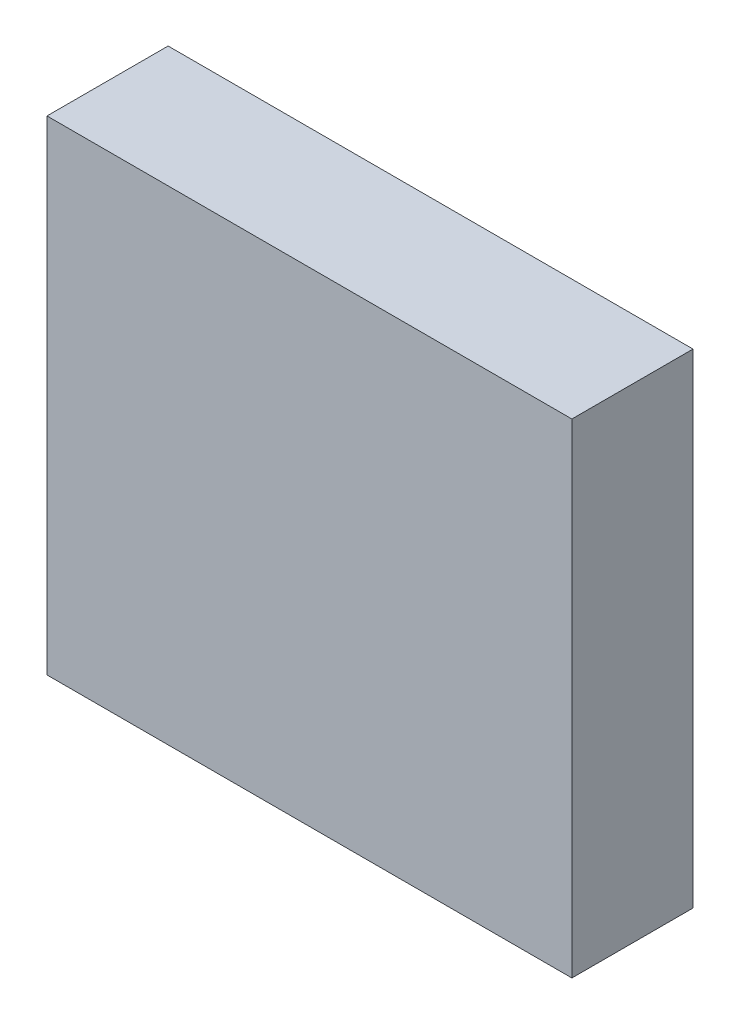
ISO-10303-21;
HEADER;
FILE_DESCRIPTION(('STEP AP214'),'2;1');
FILE_NAME('part.step','',(''),(''),'','','');
FILE_SCHEMA(('AUTOMOTIVE_DESIGN { 1 0 10303 214 1 1 1 1 }'));
ENDSEC;
DATA;
#1=APPLICATION_CONTEXT('core data for automotive mechanical design processes');
#2=APPLICATION_PROTOCOL_DEFINITION('international standard','automotive_design',2000,#1);
#3=PRODUCT_CONTEXT('',#1,'mechanical');
#4=PRODUCT('Part','Part','',(#3));
#5=PRODUCT_RELATED_PRODUCT_CATEGORY('part','',(#4));
#6=PRODUCT_DEFINITION_FORMATION('','',#4);
#7=PRODUCT_DEFINITION_CONTEXT('part definition',#1,'design');
#8=PRODUCT_DEFINITION('design','',#6,#7);
#9=PRODUCT_DEFINITION_SHAPE('','',#8);
#10=(LENGTH_UNIT() NAMED_UNIT(*) SI_UNIT(.MILLI.,.METRE.));
#11=(NAMED_UNIT(*) PLANE_ANGLE_UNIT() SI_UNIT($,.RADIAN.));
#12=(NAMED_UNIT(*) SI_UNIT($,.STERADIAN.) SOLID_ANGLE_UNIT());
#13=UNCERTAINTY_MEASURE_WITH_UNIT(LENGTH_MEASURE(1.E-05),#10,'distance_accuracy_value','');
#14=(GEOMETRIC_REPRESENTATION_CONTEXT(3) GLOBAL_UNCERTAINTY_ASSIGNED_CONTEXT((#13)) GLOBAL_UNIT_ASSIGNED_CONTEXT((#10,
#11,#12)) REPRESENTATION_CONTEXT('',''));
#15=CARTESIAN_POINT('',(0.,0.,0.));
#16=DIRECTION('',(0.,0.,1.));
#17=DIRECTION('',(1.,0.,0.));
#18=AXIS2_PLACEMENT_3D('',#15,#16,#17);
#19=CARTESIAN_POINT('',(82.55,-76.13777,38.1));
#20=DIRECTION('',(-1.,0.,0.));
#21=DIRECTION('',(0.,0.,1.));
#22=AXIS2_PLACEMENT_3D('',#19,#20,#21);
#23=PLANE('',#22);
#24=DIRECTION('',(0.,1.,0.));
#25=VECTOR('',#24,1.);
#26=CARTESIAN_POINT('',(82.55,-76.13777,0.));
#27=LINE('',#26,#25);
#28=CARTESIAN_POINT('',(82.55,-76.13777,0.));
#29=VERTEX_POINT('',#28);
#30=CARTESIAN_POINT('',(82.55,76.13777,0.));
#31=VERTEX_POINT('',#30);
#32=EDGE_CURVE('E104',#29,#31,#27,.T.);
#33=ORIENTED_EDGE('',*,*,#32,.T.);
#34=DIRECTION('',(0.,0.,-1.));
#35=VECTOR('',#34,1.);
#36=CARTESIAN_POINT('',(82.55,76.13777,38.1));
#37=LINE('',#36,#35);
#38=CARTESIAN_POINT('',(82.55,76.13777,38.1));
#39=VERTEX_POINT('',#38);
#40=EDGE_CURVE('E11',#39,#31,#37,.T.);
#41=ORIENTED_EDGE('',*,*,#40,.F.);
#42=DIRECTION('',(0.,1.,0.));
#43=VECTOR('',#42,1.);
#44=CARTESIAN_POINT('',(82.55,-76.13777,38.1));
#45=LINE('',#44,#43);
#46=CARTESIAN_POINT('',(82.55,-76.13777,38.1));
#47=VERTEX_POINT('',#46);
#48=EDGE_CURVE('E92',#47,#39,#45,.T.);
#49=ORIENTED_EDGE('',*,*,#48,.F.);
#50=DIRECTION('',(0.,0.,-1.));
#51=VECTOR('',#50,1.);
#52=CARTESIAN_POINT('',(82.55,-76.13777,38.1));
#53=LINE('',#52,#51);
#54=EDGE_CURVE('E100',#47,#29,#53,.T.);
#55=ORIENTED_EDGE('',*,*,#54,.T.);
#56=EDGE_LOOP('',(#33,#41,#49,#55));
#57=FACE_BOUND('',#56,.T.);
#58=ADVANCED_FACE('F41',(#57),#23,.F.);
#59=CARTESIAN_POINT('',(-82.55,76.13777,38.1));
#60=DIRECTION('',(0.,-1.,0.));
#61=DIRECTION('',(0.,0.,-1.));
#62=AXIS2_PLACEMENT_3D('',#59,#60,#61);
#63=PLANE('',#62);
#64=DIRECTION('',(-1.,0.,0.));
#65=VECTOR('',#64,1.);
#66=CARTESIAN_POINT('',(-82.55,76.13777,0.));
#67=LINE('',#66,#65);
#68=CARTESIAN_POINT('',(-82.55,76.13777,0.));
#69=VERTEX_POINT('',#68);
#70=EDGE_CURVE('E96',#31,#69,#67,.T.);
#71=ORIENTED_EDGE('',*,*,#70,.T.);
#72=DIRECTION('',(0.,0.,-1.));
#73=VECTOR('',#72,1.);
#74=CARTESIAN_POINT('',(-82.55,76.13777,38.1));
#75=LINE('',#74,#73);
#76=CARTESIAN_POINT('',(-82.55,76.13777,38.1));
#77=VERTEX_POINT('',#76);
#78=EDGE_CURVE('E49',#77,#69,#75,.T.);
#79=ORIENTED_EDGE('',*,*,#78,.F.);
#80=DIRECTION('',(-1.,0.,0.));
#81=VECTOR('',#80,1.);
#82=CARTESIAN_POINT('',(-82.55,76.13777,38.1));
#83=LINE('',#82,#81);
#84=EDGE_CURVE('E87',#39,#77,#83,.T.);
#85=ORIENTED_EDGE('',*,*,#84,.F.);
#86=ORIENTED_EDGE('',*,*,#40,.T.);
#87=EDGE_LOOP('',(#71,#79,#85,#86));
#88=FACE_BOUND('',#87,.T.);
#89=ADVANCED_FACE('F95',(#88),#63,.F.);
#90=CARTESIAN_POINT('',(-82.55,-76.13777,38.1));
#91=DIRECTION('',(1.,0.,0.));
#92=DIRECTION('',(0.,0.,-1.));
#93=AXIS2_PLACEMENT_3D('',#90,#91,#92);
#94=PLANE('',#93);
#95=DIRECTION('',(0.,-1.,0.));
#96=VECTOR('',#95,1.);
#97=CARTESIAN_POINT('',(-82.55,-76.13777,0.));
#98=LINE('',#97,#96);
#99=CARTESIAN_POINT('',(-82.55,-76.13777,0.));
#100=VERTEX_POINT('',#99);
#101=EDGE_CURVE('E74',#69,#100,#98,.T.);
#102=ORIENTED_EDGE('',*,*,#101,.T.);
#103=DIRECTION('',(0.,0.,-1.));
#104=VECTOR('',#103,1.);
#105=CARTESIAN_POINT('',(-82.55,-76.13777,38.1));
#106=LINE('',#105,#104);
#107=CARTESIAN_POINT('',(-82.55,-76.13777,38.1));
#108=VERTEX_POINT('',#107);
#109=EDGE_CURVE('E97',#108,#100,#106,.T.);
#110=ORIENTED_EDGE('',*,*,#109,.F.);
#111=DIRECTION('',(0.,-1.,0.));
#112=VECTOR('',#111,1.);
#113=CARTESIAN_POINT('',(-82.55,-76.13777,38.1));
#114=LINE('',#113,#112);
#115=EDGE_CURVE('E90',#77,#108,#114,.T.);
#116=ORIENTED_EDGE('',*,*,#115,.F.);
#117=ORIENTED_EDGE('',*,*,#78,.T.);
#118=EDGE_LOOP('',(#102,#110,#116,#117));
#119=FACE_BOUND('',#118,.T.);
#120=ADVANCED_FACE('F98',(#119),#94,.F.);
#121=CARTESIAN_POINT('',(-82.55,-76.13777,38.1));
#122=DIRECTION('',(0.,1.,0.));
#123=DIRECTION('',(0.,0.,1.));
#124=AXIS2_PLACEMENT_3D('',#121,#122,#123);
#125=PLANE('',#124);
#126=DIRECTION('',(1.,0.,0.));
#127=VECTOR('',#126,1.);
#128=CARTESIAN_POINT('',(-82.55,-76.13777,0.));
#129=LINE('',#128,#127);
#130=EDGE_CURVE('E80',#100,#29,#129,.T.);
#131=ORIENTED_EDGE('',*,*,#130,.T.);
#132=ORIENTED_EDGE('',*,*,#54,.F.);
#133=DIRECTION('',(1.,0.,0.));
#134=VECTOR('',#133,1.);
#135=CARTESIAN_POINT('',(-82.55,-76.13777,38.1));
#136=LINE('',#135,#134);
#137=EDGE_CURVE('E57',#108,#47,#136,.T.);
#138=ORIENTED_EDGE('',*,*,#137,.F.);
#139=ORIENTED_EDGE('',*,*,#109,.T.);
#140=EDGE_LOOP('',(#131,#132,#138,#139));
#141=FACE_BOUND('',#140,.T.);
#142=ADVANCED_FACE('F111',(#141),#125,.F.);
#143=CARTESIAN_POINT('',(0.,0.,38.1));
#144=DIRECTION('',(0.,0.,-1.));
#145=DIRECTION('',(-1.,0.,0.));
#146=AXIS2_PLACEMENT_3D('',#143,#144,#145);
#147=PLANE('',#146);
#148=ORIENTED_EDGE('',*,*,#48,.T.);
#149=ORIENTED_EDGE('',*,*,#84,.T.);
#150=ORIENTED_EDGE('',*,*,#115,.T.);
#151=ORIENTED_EDGE('',*,*,#137,.T.);
#152=EDGE_LOOP('',(#148,#149,#150,#151));
#153=FACE_BOUND('',#152,.T.);
#154=ADVANCED_FACE('F88',(#153),#147,.F.);
#155=CARTESIAN_POINT('',(0.,0.,0.));
#156=DIRECTION('',(0.,0.,-1.));
#157=DIRECTION('',(-1.,0.,0.));
#158=AXIS2_PLACEMENT_3D('',#155,#156,#157);
#159=PLANE('',#158);
#160=ORIENTED_EDGE('',*,*,#32,.F.);
#161=ORIENTED_EDGE('',*,*,#130,.F.);
#162=ORIENTED_EDGE('',*,*,#101,.F.);
#163=ORIENTED_EDGE('',*,*,#70,.F.);
#164=EDGE_LOOP('',(#160,#161,#162,#163));
#165=FACE_BOUND('',#164,.T.);
#166=ADVANCED_FACE('F114',(#165),#159,.T.);
#167=CLOSED_SHELL('',(#58,#89,#120,#142,#154,#166));
#168=MANIFOLD_SOLID_BREP('B2',#167);
#169=ADVANCED_BREP_SHAPE_REPRESENTATION('',(#18,#168),#14);
#170=SHAPE_DEFINITION_REPRESENTATION(#9,#169);
ENDSEC;
END-ISO-10303-21;
